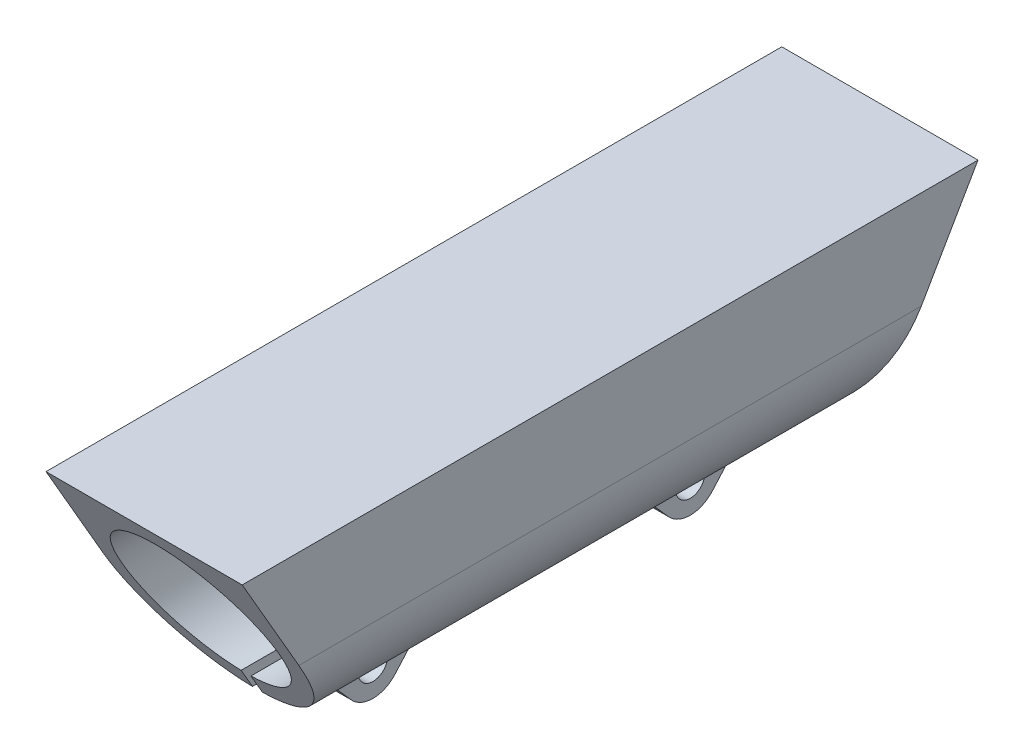
ISO-10303-21;
HEADER;
FILE_DESCRIPTION(('STEP AP214'),'2;1');
FILE_NAME('part.step','',(''),(''),'','','');
FILE_SCHEMA(('AUTOMOTIVE_DESIGN { 1 0 10303 214 1 1 1 1 }'));
ENDSEC;
DATA;
#1=APPLICATION_CONTEXT('core data for automotive mechanical design processes');
#2=APPLICATION_PROTOCOL_DEFINITION('international standard','automotive_design',2000,#1);
#3=PRODUCT_CONTEXT('',#1,'mechanical');
#4=PRODUCT('Part','Part','',(#3));
#5=PRODUCT_RELATED_PRODUCT_CATEGORY('part','',(#4));
#6=PRODUCT_DEFINITION_FORMATION('','',#4);
#7=PRODUCT_DEFINITION_CONTEXT('part definition',#1,'design');
#8=PRODUCT_DEFINITION('design','',#6,#7);
#9=PRODUCT_DEFINITION_SHAPE('','',#8);
#10=(LENGTH_UNIT() NAMED_UNIT(*) SI_UNIT(.MILLI.,.METRE.));
#11=(NAMED_UNIT(*) PLANE_ANGLE_UNIT() SI_UNIT($,.RADIAN.));
#12=(NAMED_UNIT(*) SI_UNIT($,.STERADIAN.) SOLID_ANGLE_UNIT());
#13=UNCERTAINTY_MEASURE_WITH_UNIT(LENGTH_MEASURE(1.E-05),#10,'distance_accuracy_value','');
#14=(GEOMETRIC_REPRESENTATION_CONTEXT(3) GLOBAL_UNCERTAINTY_ASSIGNED_CONTEXT((#13)) GLOBAL_UNIT_ASSIGNED_CONTEXT((#10,
#11,#12)) REPRESENTATION_CONTEXT('',''));
#15=CARTESIAN_POINT('',(0.,0.,0.));
#16=DIRECTION('',(0.,0.,1.));
#17=DIRECTION('',(1.,0.,0.));
#18=AXIS2_PLACEMENT_3D('',#15,#16,#17);
#19=CARTESIAN_POINT('',(2.,-9.05785759721761,60.));
#20=DIRECTION('',(0.,0.662204285051868,-0.749323351337021));
#21=DIRECTION('',(0.,0.749323351337021,0.662204285051868));
#22=AXIS2_PLACEMENT_3D('',#19,#20,#21);
#23=PLANE('',#22);
#24=CARTESIAN_POINT('',(0.,0.,68.0047580307815));
#25=DIRECTION('',(0.,0.662204285051868,-0.749323351337021));
#26=DIRECTION('',(0.,-0.749323351337021,-0.662204285051868));
#27=AXIS2_PLACEMENT_3D('',#24,#25,#26);
#28=ELLIPSE('',#27,13.3453735055193,10.);
#29=CARTESIAN_POINT('',(2.,-9.79795897113272,59.3459455116341));
#30=VERTEX_POINT('',#29);
#31=CARTESIAN_POINT('',(0.5,-9.9874921777191,59.1784481270442));
#32=VERTEX_POINT('',#31);
#33=EDGE_CURVE('E379',#30,#32,#28,.T.);
#34=ORIENTED_EDGE('',*,*,#33,.T.);
#35=DIRECTION('',(0.,-0.749323351337021,-0.662204285051868));
#36=VECTOR('',#35,1.);
#37=CARTESIAN_POINT('',(0.5,-9.05785759721761,60.));
#38=LINE('',#37,#36);
#39=CARTESIAN_POINT('',(0.5,-13.6764653678284,55.9183684170324));
#40=VERTEX_POINT('',#39);
#41=EDGE_CURVE('E298',#32,#40,#38,.T.);
#42=ORIENTED_EDGE('',*,*,#41,.T.);
#43=DIRECTION('',(-1.,0.,0.));
#44=VECTOR('',#43,1.);
#45=CARTESIAN_POINT('',(2.,-13.6764653678284,55.9183684170324));
#46=LINE('',#45,#44);
#47=CARTESIAN_POINT('',(2.,-13.6764653678284,55.9183684170324));
#48=VERTEX_POINT('',#47);
#49=EDGE_CURVE('E367',#48,#40,#46,.T.);
#50=ORIENTED_EDGE('',*,*,#49,.F.);
#51=DIRECTION('',(0.,-0.749323351337021,-0.662204285051868));
#52=VECTOR('',#51,1.);
#53=CARTESIAN_POINT('',(2.,-9.05785759721761,60.));
#54=LINE('',#53,#52);
#55=EDGE_CURVE('E347',#30,#48,#54,.T.);
#56=ORIENTED_EDGE('',*,*,#55,.F.);
#57=EDGE_LOOP('',(#34,#42,#50,#56));
#58=FACE_BOUND('',#57,.T.);
#59=ADVANCED_FACE('F41',(#58),#23,.F.);
#60=CARTESIAN_POINT('',(2.,-13.6764653678284,51.4224283090103));
#61=DIRECTION('',(0.,0.662204285051867,0.749323351337022));
#62=DIRECTION('',(0.,-0.749323351337022,0.662204285051867));
#63=AXIS2_PLACEMENT_3D('',#60,#61,#62);
#64=PLANE('',#63);
#65=DIRECTION('',(-1.,0.,0.));
#66=VECTOR('',#65,1.);
#67=CARTESIAN_POINT('',(2.,-13.6764653678284,51.4224283090103));
#68=LINE('',#67,#66);
#69=CARTESIAN_POINT('',(2.,-13.6764653678284,51.4224283090103));
#70=VERTEX_POINT('',#69);
#71=CARTESIAN_POINT('',(0.5,-13.6764653678284,51.4224283090103));
#72=VERTEX_POINT('',#71);
#73=EDGE_CURVE('E363',#70,#72,#68,.T.);
#74=ORIENTED_EDGE('',*,*,#73,.T.);
#75=DIRECTION('',(0.,0.749323351337022,-0.662204285051867));
#76=VECTOR('',#75,1.);
#77=CARTESIAN_POINT('',(0.5,-13.6764653678284,51.4224283090103));
#78=LINE('',#77,#76);
#79=CARTESIAN_POINT('',(0.5,-9.98749217771909,48.1623485989985));
#80=VERTEX_POINT('',#79);
#81=EDGE_CURVE('E296',#72,#80,#78,.T.);
#82=ORIENTED_EDGE('',*,*,#81,.T.);
#83=CARTESIAN_POINT('',(0.,0.,39.3360386952612));
#84=DIRECTION('',(0.,0.662204285051867,0.749323351337022));
#85=DIRECTION('',(0.,0.749323351337022,-0.662204285051867));
#86=AXIS2_PLACEMENT_3D('',#83,#84,#85);
#87=ELLIPSE('',#86,13.3453735055193,10.);
#88=CARTESIAN_POINT('',(2.,-9.79795897113272,47.9948512144085));
#89=VERTEX_POINT('',#88);
#90=EDGE_CURVE('E373',#80,#89,#87,.T.);
#91=ORIENTED_EDGE('',*,*,#90,.T.);
#92=DIRECTION('',(0.,0.749323351337022,-0.662204285051867));
#93=VECTOR('',#92,1.);
#94=CARTESIAN_POINT('',(2.,-13.6764653678284,51.4224283090103));
#95=LINE('',#94,#93);
#96=EDGE_CURVE('E352',#70,#89,#95,.T.);
#97=ORIENTED_EDGE('',*,*,#96,.F.);
#98=EDGE_LOOP('',(#74,#82,#91,#97));
#99=FACE_BOUND('',#98,.T.);
#100=ADVANCED_FACE('F434',(#99),#64,.F.);
#101=CARTESIAN_POINT('',(2.,-11.6898525126728,53.6703983630213));
#102=DIRECTION('',(-1.,0.,0.));
#103=DIRECTION('',(0.,0.,1.));
#104=AXIS2_PLACEMENT_3D('',#101,#102,#103);
#105=CYLINDRICAL_SURFACE('',#104,3.);
#106=CARTESIAN_POINT('',(0.5,-11.6898525126728,53.6703983630213));
#107=DIRECTION('',(1.,0.,0.));
#108=DIRECTION('',(0.,0.,-1.));
#109=AXIS2_PLACEMENT_3D('',#106,#107,#108);
#110=CIRCLE('',#109,3.);
#111=EDGE_CURVE('E294',#40,#72,#110,.T.);
#112=ORIENTED_EDGE('',*,*,#111,.T.);
#113=ORIENTED_EDGE('',*,*,#73,.F.);
#114=CARTESIAN_POINT('',(2.,-11.6898525126728,53.6703983630213));
#115=DIRECTION('',(1.,0.,0.));
#116=DIRECTION('',(0.,0.,-1.));
#117=AXIS2_PLACEMENT_3D('',#114,#115,#116);
#118=CIRCLE('',#117,3.);
#119=EDGE_CURVE('E349',#48,#70,#118,.T.);
#120=ORIENTED_EDGE('',*,*,#119,.F.);
#121=ORIENTED_EDGE('',*,*,#49,.T.);
#122=EDGE_LOOP('',(#112,#113,#120,#121));
#123=FACE_BOUND('',#122,.T.);
#124=ADVANCED_FACE('F447',(#123),#105,.T.);
#125=CARTESIAN_POINT('',(2.,-11.6898525126728,53.6703983630213));
#126=DIRECTION('',(-1.,0.,0.));
#127=DIRECTION('',(0.,0.,1.));
#128=AXIS2_PLACEMENT_3D('',#125,#126,#127);
#129=CYLINDRICAL_SURFACE('',#128,1.49999999999999);
#130=CARTESIAN_POINT('',(0.5,-11.6898525126728,53.6703983630213));
#131=DIRECTION('',(1.,0.,0.));
#132=DIRECTION('',(0.,0.,-1.));
#133=AXIS2_PLACEMENT_3D('',#130,#131,#132);
#134=CIRCLE('',#133,1.49999999999999);
#135=CARTESIAN_POINT('',(0.5,-11.6898525126728,52.1703983630213));
#136=VERTEX_POINT('',#135);
#137=EDGE_CURVE('E291',#136,#136,#134,.T.);
#138=ORIENTED_EDGE('',*,*,#137,.F.);
#139=EDGE_LOOP('',(#138));
#140=FACE_BOUND('',#139,.T.);
#141=CARTESIAN_POINT('',(2.,-11.6898525126728,53.6703983630213));
#142=DIRECTION('',(1.,0.,0.));
#143=DIRECTION('',(0.,0.,-1.));
#144=AXIS2_PLACEMENT_3D('',#141,#142,#143);
#145=CIRCLE('',#144,1.49999999999999);
#146=CARTESIAN_POINT('',(2.,-11.6898525126728,52.1703983630213));
#147=VERTEX_POINT('',#146);
#148=EDGE_CURVE('E341',#147,#147,#145,.T.);
#149=ORIENTED_EDGE('',*,*,#148,.T.);
#150=EDGE_LOOP('',(#149));
#151=FACE_BOUND('',#150,.T.);
#152=ADVANCED_FACE('F487',(#140,#151),#129,.F.);
#153=CARTESIAN_POINT('',(2.,-13.6764653678284,23.5775716909897));
#154=DIRECTION('',(0.,0.662204285051867,-0.749323351337022));
#155=DIRECTION('',(0.,0.749323351337022,0.662204285051867));
#156=AXIS2_PLACEMENT_3D('',#153,#154,#155);
#157=PLANE('',#156);
#158=CARTESIAN_POINT('',(0.,0.,35.6639613047388));
#159=DIRECTION('',(0.,0.662204285051867,-0.749323351337022));
#160=DIRECTION('',(0.,-0.749323351337022,-0.662204285051867));
#161=AXIS2_PLACEMENT_3D('',#158,#159,#160);
#162=ELLIPSE('',#161,13.3453735055193,10.);
#163=CARTESIAN_POINT('',(2.,-9.79795897113272,27.0051487855915));
#164=VERTEX_POINT('',#163);
#165=CARTESIAN_POINT('',(0.5,-9.98749217771909,26.8376514010015));
#166=VERTEX_POINT('',#165);
#167=EDGE_CURVE('E58',#164,#166,#162,.T.);
#168=ORIENTED_EDGE('',*,*,#167,.T.);
#169=DIRECTION('',(0.,-0.749323351337022,-0.662204285051867));
#170=VECTOR('',#169,1.);
#171=CARTESIAN_POINT('',(0.5,-13.6764653678284,23.5775716909897));
#172=LINE('',#171,#170);
#173=CARTESIAN_POINT('',(0.5,-13.6764653678284,23.5775716909897));
#174=VERTEX_POINT('',#173);
#175=EDGE_CURVE('E288',#166,#174,#172,.T.);
#176=ORIENTED_EDGE('',*,*,#175,.T.);
#177=DIRECTION('',(-1.,0.,0.));
#178=VECTOR('',#177,1.);
#179=CARTESIAN_POINT('',(2.,-13.6764653678284,23.5775716909897));
#180=LINE('',#179,#178);
#181=CARTESIAN_POINT('',(2.,-13.6764653678284,23.5775716909897));
#182=VERTEX_POINT('',#181);
#183=EDGE_CURVE('E302',#182,#174,#180,.T.);
#184=ORIENTED_EDGE('',*,*,#183,.F.);
#185=DIRECTION('',(0.,-0.749323351337022,-0.662204285051867));
#186=VECTOR('',#185,1.);
#187=CARTESIAN_POINT('',(2.,-13.6764653678284,23.5775716909897));
#188=LINE('',#187,#186);
#189=EDGE_CURVE('E314',#164,#182,#188,.T.);
#190=ORIENTED_EDGE('',*,*,#189,.F.);
#191=EDGE_LOOP('',(#168,#176,#184,#190));
#192=FACE_BOUND('',#191,.T.);
#193=ADVANCED_FACE('F491',(#192),#157,.F.);
#194=CARTESIAN_POINT('',(2.,-9.05785759721761,15.));
#195=DIRECTION('',(0.,0.662204285051868,0.749323351337021));
#196=DIRECTION('',(0.,-0.749323351337021,0.662204285051868));
#197=AXIS2_PLACEMENT_3D('',#194,#195,#196);
#198=PLANE('',#197);
#199=DIRECTION('',(-1.,0.,0.));
#200=VECTOR('',#199,1.);
#201=CARTESIAN_POINT('',(2.,-13.6764653678284,19.0816315829676));
#202=LINE('',#201,#200);
#203=CARTESIAN_POINT('',(2.,-13.6764653678284,19.0816315829676));
#204=VERTEX_POINT('',#203);
#205=CARTESIAN_POINT('',(0.5,-13.6764653678284,19.0816315829676));
#206=VERTEX_POINT('',#205);
#207=EDGE_CURVE('E306',#204,#206,#202,.T.);
#208=ORIENTED_EDGE('',*,*,#207,.T.);
#209=DIRECTION('',(0.,0.749323351337021,-0.662204285051868));
#210=VECTOR('',#209,1.);
#211=CARTESIAN_POINT('',(0.5,-9.05785759721761,15.));
#212=LINE('',#211,#210);
#213=CARTESIAN_POINT('',(0.5,-9.98749217771909,15.8215518729558));
#214=VERTEX_POINT('',#213);
#215=EDGE_CURVE('E286',#206,#214,#212,.T.);
#216=ORIENTED_EDGE('',*,*,#215,.T.);
#217=CARTESIAN_POINT('',(0.,0.,6.99524196921851));
#218=DIRECTION('',(0.,0.662204285051868,0.749323351337021));
#219=DIRECTION('',(0.,0.749323351337021,-0.662204285051868));
#220=AXIS2_PLACEMENT_3D('',#217,#218,#219);
#221=ELLIPSE('',#220,13.3453735055193,10.);
#222=CARTESIAN_POINT('',(2.,-9.79795897113272,15.6540544883659));
#223=VERTEX_POINT('',#222);
#224=EDGE_CURVE('E334',#214,#223,#221,.T.);
#225=ORIENTED_EDGE('',*,*,#224,.T.);
#226=DIRECTION('',(0.,0.749323351337021,-0.662204285051868));
#227=VECTOR('',#226,1.);
#228=CARTESIAN_POINT('',(2.,-9.05785759721761,15.));
#229=LINE('',#228,#227);
#230=EDGE_CURVE('E309',#204,#223,#229,.T.);
#231=ORIENTED_EDGE('',*,*,#230,.F.);
#232=EDGE_LOOP('',(#208,#216,#225,#231));
#233=FACE_BOUND('',#232,.T.);
#234=ADVANCED_FACE('F542',(#233),#198,.F.);
#235=CARTESIAN_POINT('',(2.,-11.6898525126728,21.3296016369787));
#236=DIRECTION('',(-1.,0.,0.));
#237=DIRECTION('',(0.,0.,1.));
#238=AXIS2_PLACEMENT_3D('',#235,#236,#237);
#239=CYLINDRICAL_SURFACE('',#238,3.);
#240=CARTESIAN_POINT('',(0.5,-11.6898525126728,21.3296016369787));
#241=DIRECTION('',(1.,0.,0.));
#242=DIRECTION('',(0.,0.,-1.));
#243=AXIS2_PLACEMENT_3D('',#240,#241,#242);
#244=CIRCLE('',#243,3.);
#245=EDGE_CURVE('E284',#174,#206,#244,.T.);
#246=ORIENTED_EDGE('',*,*,#245,.T.);
#247=ORIENTED_EDGE('',*,*,#207,.F.);
#248=CARTESIAN_POINT('',(2.,-11.6898525126728,21.3296016369787));
#249=DIRECTION('',(1.,0.,0.));
#250=DIRECTION('',(0.,0.,1.));
#251=AXIS2_PLACEMENT_3D('',#248,#249,#250);
#252=CIRCLE('',#251,3.);
#253=EDGE_CURVE('E323',#182,#204,#252,.T.);
#254=ORIENTED_EDGE('',*,*,#253,.F.);
#255=ORIENTED_EDGE('',*,*,#183,.T.);
#256=EDGE_LOOP('',(#246,#247,#254,#255));
#257=FACE_BOUND('',#256,.T.);
#258=ADVANCED_FACE('F537',(#257),#239,.T.);
#259=CARTESIAN_POINT('',(2.,-11.6898525126728,21.3296016369787));
#260=DIRECTION('',(-1.,0.,0.));
#261=DIRECTION('',(0.,0.,1.));
#262=AXIS2_PLACEMENT_3D('',#259,#260,#261);
#263=CYLINDRICAL_SURFACE('',#262,1.50000000000001);
#264=CARTESIAN_POINT('',(0.5,-11.6898525126728,21.3296016369787));
#265=DIRECTION('',(1.,0.,0.));
#266=DIRECTION('',(0.,0.,-1.));
#267=AXIS2_PLACEMENT_3D('',#264,#265,#266);
#268=CIRCLE('',#267,1.50000000000001);
#269=CARTESIAN_POINT('',(0.5,-11.6898525126728,19.8296016369787));
#270=VERTEX_POINT('',#269);
#271=EDGE_CURVE('E45',#270,#270,#268,.T.);
#272=ORIENTED_EDGE('',*,*,#271,.F.);
#273=EDGE_LOOP('',(#272));
#274=FACE_BOUND('',#273,.T.);
#275=CARTESIAN_POINT('',(2.,-11.6898525126728,21.3296016369787));
#276=DIRECTION('',(1.,0.,0.));
#277=DIRECTION('',(0.,0.,1.));
#278=AXIS2_PLACEMENT_3D('',#275,#276,#277);
#279=CIRCLE('',#278,1.50000000000001);
#280=CARTESIAN_POINT('',(2.,-11.6898525126728,22.8296016369787));
#281=VERTEX_POINT('',#280);
#282=EDGE_CURVE('E320',#281,#281,#279,.T.);
#283=ORIENTED_EDGE('',*,*,#282,.T.);
#284=EDGE_LOOP('',(#283));
#285=FACE_BOUND('',#284,.T.);
#286=ADVANCED_FACE('F533',(#274,#285),#263,.F.);
#287=CARTESIAN_POINT('',(0.5,-7.98435971133565,75.));
#288=DIRECTION('',(1.,0.,0.));
#289=DIRECTION('',(0.,1.,0.));
#290=AXIS2_PLACEMENT_3D('',#287,#288,#289);
#291=PLANE('',#290);
#292=DIRECTION('',(0.,0.,-1.));
#293=VECTOR('',#292,1.);
#294=CARTESIAN_POINT('',(0.500000000000005,-9.98749217771909,75.));
#295=LINE('',#294,#293);
#296=CARTESIAN_POINT('',(0.500000000000056,-9.98749217771909,63.4557434679124));
#297=VERTEX_POINT('',#296);
#298=EDGE_CURVE('E240',#297,#32,#295,.T.);
#299=ORIENTED_EDGE('',*,*,#298,.F.);
#300=DIRECTION('',(0.,0.865941487065101,0.50014531986162));
#301=VECTOR('',#300,1.);
#302=CARTESIAN_POINT('',(0.5,-3.48565591904593,67.2110352790293));
#303=LINE('',#302,#301);
#304=CARTESIAN_POINT('',(0.5,-7.98435971133565,64.6127007717137));
#305=VERTEX_POINT('',#304);
#306=EDGE_CURVE('E260',#297,#305,#303,.T.);
#307=ORIENTED_EDGE('',*,*,#306,.T.);
#308=DIRECTION('',(0.,0.,-1.));
#309=VECTOR('',#308,1.);
#310=CARTESIAN_POINT('',(0.5,-7.98435971133565,75.));
#311=LINE('',#310,#309);
#312=CARTESIAN_POINT('',(0.5,-7.98435971133565,10.3872992282863));
#313=VERTEX_POINT('',#312);
#314=EDGE_CURVE('E242',#305,#313,#311,.T.);
#315=ORIENTED_EDGE('',*,*,#314,.T.);
#316=DIRECTION('',(0.,-0.865941487065101,0.50014531986162));
#317=VECTOR('',#316,1.);
#318=CARTESIAN_POINT('',(0.500000000000002,-35.9678995712676,26.5498652944319));
#319=LINE('',#318,#317);
#320=CARTESIAN_POINT('',(0.499999999998769,-9.98749217771909,11.5442565320876));
#321=VERTEX_POINT('',#320);
#322=EDGE_CURVE('E471',#313,#321,#319,.T.);
#323=ORIENTED_EDGE('',*,*,#322,.T.);
#324=EDGE_CURVE('E239',#214,#321,#295,.T.);
#325=ORIENTED_EDGE('',*,*,#324,.F.);
#326=ORIENTED_EDGE('',*,*,#215,.F.);
#327=ORIENTED_EDGE('',*,*,#245,.F.);
#328=ORIENTED_EDGE('',*,*,#175,.F.);
#329=EDGE_CURVE('E243',#80,#166,#295,.T.);
#330=ORIENTED_EDGE('',*,*,#329,.F.);
#331=ORIENTED_EDGE('',*,*,#81,.F.);
#332=ORIENTED_EDGE('',*,*,#111,.F.);
#333=ORIENTED_EDGE('',*,*,#41,.F.);
#334=EDGE_LOOP('',(#299,#307,#315,#323,#325,#326,#327,#328,#330,#331,#332,#333));
#335=FACE_BOUND('',#334,.T.);
#336=ORIENTED_EDGE('',*,*,#271,.T.);
#337=EDGE_LOOP('',(#336));
#338=FACE_BOUND('',#337,.T.);
#339=ORIENTED_EDGE('',*,*,#137,.T.);
#340=EDGE_LOOP('',(#339));
#341=FACE_BOUND('',#340,.T.);
#342=ADVANCED_FACE('F462',(#335,#338,#341),#291,.F.);
#343=CARTESIAN_POINT('',(0.,0.,75.));
#344=DIRECTION('',(0.,0.,-1.));
#345=DIRECTION('',(-1.,0.,0.));
#346=AXIS2_PLACEMENT_3D('',#343,#344,#345);
#347=CYLINDRICAL_SURFACE('',#346,10.);
#348=DIRECTION('',(0.,0.,-1.));
#349=VECTOR('',#348,1.);
#350=CARTESIAN_POINT('',(10.,0.,75.));
#351=LINE('',#350,#349);
#352=CARTESIAN_POINT('',(10.,0.,69.2242596372563));
#353=VERTEX_POINT('',#352);
#354=CARTESIAN_POINT('',(10.,0.,5.7757403627437));
#355=VERTEX_POINT('',#354);
#356=EDGE_CURVE('E231',#353,#355,#351,.T.);
#357=ORIENTED_EDGE('',*,*,#356,.F.);
#358=CARTESIAN_POINT('',(0.,0.,69.2242596372563));
#359=DIRECTION('',(0.,0.50014531986162,-0.865941487065101));
#360=DIRECTION('',(0.,-0.865941487065101,-0.50014531986162));
#361=AXIS2_PLACEMENT_3D('',#358,#359,#360);
#362=ELLIPSE('',#361,11.5481243818131,10.);
#363=EDGE_CURVE('E254',#353,#297,#362,.T.);
#364=ORIENTED_EDGE('',*,*,#363,.T.);
#365=ORIENTED_EDGE('',*,*,#298,.T.);
#366=ORIENTED_EDGE('',*,*,#33,.F.);
#367=DIRECTION('',(0.,0.,-1.));
#368=VECTOR('',#367,1.);
#369=CARTESIAN_POINT('',(2.,-9.79795897113272,75.));
#370=LINE('',#369,#368);
#371=EDGE_CURVE('E249',#30,#89,#370,.T.);
#372=ORIENTED_EDGE('',*,*,#371,.T.);
#373=ORIENTED_EDGE('',*,*,#90,.F.);
#374=ORIENTED_EDGE('',*,*,#329,.T.);
#375=ORIENTED_EDGE('',*,*,#167,.F.);
#376=DIRECTION('',(0.,0.,-1.));
#377=VECTOR('',#376,1.);
#378=CARTESIAN_POINT('',(2.,-9.79795897113272,75.));
#379=LINE('',#378,#377);
#380=EDGE_CURVE('E11',#223,#164,#379,.F.);
#381=ORIENTED_EDGE('',*,*,#380,.F.);
#382=ORIENTED_EDGE('',*,*,#224,.F.);
#383=ORIENTED_EDGE('',*,*,#324,.T.);
#384=CARTESIAN_POINT('',(0.,0.,5.7757403627437));
#385=DIRECTION('',(0.,0.50014531986162,0.865941487065101));
#386=DIRECTION('',(0.,0.865941487065101,-0.50014531986162));
#387=AXIS2_PLACEMENT_3D('',#384,#385,#386);
#388=ELLIPSE('',#387,11.5481243818131,10.);
#389=EDGE_CURVE('E468',#321,#355,#388,.T.);
#390=ORIENTED_EDGE('',*,*,#389,.T.);
#391=EDGE_LOOP('',(#357,#364,#365,#366,#372,#373,#374,#375,#381,#382,#383,#390));
#392=FACE_BOUND('',#391,.T.);
#393=ADVANCED_FACE('F453',(#392),#347,.T.);
#394=CARTESIAN_POINT('',(0.,0.,75.));
#395=DIRECTION('',(0.,0.,-1.));
#396=DIRECTION('',(-1.,0.,0.));
#397=AXIS2_PLACEMENT_3D('',#394,#395,#396);
#398=CYLINDRICAL_SURFACE('',#397,10.);
#399=DIRECTION('',(0.,0.,-1.));
#400=VECTOR('',#399,1.);
#401=CARTESIAN_POINT('',(-0.5,-9.98749217771909,75.));
#402=LINE('',#401,#400);
#403=CARTESIAN_POINT('',(-0.500000000000004,-9.98749217771909,63.4557434679124));
#404=VERTEX_POINT('',#403);
#405=CARTESIAN_POINT('',(-0.5,-9.9874921777191,59.1784481270442));
#406=VERTEX_POINT('',#405);
#407=EDGE_CURVE('E233',#404,#406,#402,.T.);
#408=ORIENTED_EDGE('',*,*,#407,.F.);
#409=CARTESIAN_POINT('',(0.,0.,69.2242596372563));
#410=DIRECTION('',(0.,0.50014531986162,-0.865941487065101));
#411=DIRECTION('',(0.,-0.865941487065101,-0.50014531986162));
#412=AXIS2_PLACEMENT_3D('',#409,#410,#411);
#413=ELLIPSE('',#412,11.5481243818131,10.);
#414=CARTESIAN_POINT('',(-10.,0.,69.2242596372563));
#415=VERTEX_POINT('',#414);
#416=EDGE_CURVE('E265',#404,#415,#413,.T.);
#417=ORIENTED_EDGE('',*,*,#416,.T.);
#418=DIRECTION('',(0.,0.,-1.));
#419=VECTOR('',#418,1.);
#420=CARTESIAN_POINT('',(-10.,0.,75.));
#421=LINE('',#420,#419);
#422=CARTESIAN_POINT('',(-10.,0.,5.7757403627437));
#423=VERTEX_POINT('',#422);
#424=EDGE_CURVE('E224',#415,#423,#421,.T.);
#425=ORIENTED_EDGE('',*,*,#424,.T.);
#426=CARTESIAN_POINT('',(0.,0.,5.7757403627437));
#427=DIRECTION('',(0.,0.50014531986162,0.865941487065101));
#428=DIRECTION('',(0.,0.865941487065101,-0.50014531986162));
#429=AXIS2_PLACEMENT_3D('',#426,#427,#428);
#430=ELLIPSE('',#429,11.5481243818131,10.);
#431=CARTESIAN_POINT('',(-0.500000000000004,-9.98749217771909,11.5442565320876));
#432=VERTEX_POINT('',#431);
#433=EDGE_CURVE('E399',#423,#432,#430,.T.);
#434=ORIENTED_EDGE('',*,*,#433,.T.);
#435=CARTESIAN_POINT('',(-0.5,-9.98749217771909,15.8215518729558));
#436=VERTEX_POINT('',#435);
#437=EDGE_CURVE('E384',#436,#432,#402,.T.);
#438=ORIENTED_EDGE('',*,*,#437,.F.);
#439=CARTESIAN_POINT('',(0.,0.,6.99524196921851));
#440=DIRECTION('',(0.,0.662204285051868,0.749323351337021));
#441=DIRECTION('',(0.,0.749323351337021,-0.662204285051868));
#442=AXIS2_PLACEMENT_3D('',#439,#440,#441);
#443=ELLIPSE('',#442,13.3453735055193,10.);
#444=CARTESIAN_POINT('',(-2.,-9.79795897113272,15.6540544883659));
#445=VERTEX_POINT('',#444);
#446=EDGE_CURVE('E329',#445,#436,#443,.T.);
#447=ORIENTED_EDGE('',*,*,#446,.F.);
#448=DIRECTION('',(0.,0.,-1.));
#449=VECTOR('',#448,1.);
#450=CARTESIAN_POINT('',(-2.,-9.79795897113272,75.));
#451=LINE('',#450,#449);
#452=CARTESIAN_POINT('',(-2.,-9.79795897113272,27.0051487855915));
#453=VERTEX_POINT('',#452);
#454=EDGE_CURVE('E50',#445,#453,#451,.F.);
#455=ORIENTED_EDGE('',*,*,#454,.T.);
#456=CARTESIAN_POINT('',(0.,0.,35.6639613047388));
#457=DIRECTION('',(0.,0.662204285051867,-0.749323351337022));
#458=DIRECTION('',(0.,-0.749323351337022,-0.662204285051867));
#459=AXIS2_PLACEMENT_3D('',#456,#457,#458);
#460=ELLIPSE('',#459,13.3453735055193,10.);
#461=CARTESIAN_POINT('',(-0.5,-9.98749217771909,26.8376514010015));
#462=VERTEX_POINT('',#461);
#463=EDGE_CURVE('E337',#462,#453,#460,.T.);
#464=ORIENTED_EDGE('',*,*,#463,.F.);
#465=CARTESIAN_POINT('',(-0.5,-9.98749217771909,48.1623485989985));
#466=VERTEX_POINT('',#465);
#467=EDGE_CURVE('E385',#466,#462,#402,.T.);
#468=ORIENTED_EDGE('',*,*,#467,.F.);
#469=CARTESIAN_POINT('',(0.,0.,39.3360386952612));
#470=DIRECTION('',(0.,0.662204285051867,0.749323351337022));
#471=DIRECTION('',(0.,0.749323351337022,-0.662204285051867));
#472=AXIS2_PLACEMENT_3D('',#469,#470,#471);
#473=ELLIPSE('',#472,13.3453735055193,10.);
#474=CARTESIAN_POINT('',(-2.,-9.79795897113272,47.9948512144085));
#475=VERTEX_POINT('',#474);
#476=EDGE_CURVE('E370',#475,#466,#473,.T.);
#477=ORIENTED_EDGE('',*,*,#476,.F.);
#478=DIRECTION('',(0.,0.,-1.));
#479=VECTOR('',#478,1.);
#480=CARTESIAN_POINT('',(-2.,-9.79795897113272,75.));
#481=LINE('',#480,#479);
#482=CARTESIAN_POINT('',(-2.,-9.79795897113272,59.3459455116341));
#483=VERTEX_POINT('',#482);
#484=EDGE_CURVE('E246',#483,#475,#481,.T.);
#485=ORIENTED_EDGE('',*,*,#484,.F.);
#486=CARTESIAN_POINT('',(0.,0.,68.0047580307815));
#487=DIRECTION('',(0.,0.662204285051868,-0.749323351337021));
#488=DIRECTION('',(0.,-0.749323351337021,-0.662204285051868));
#489=AXIS2_PLACEMENT_3D('',#486,#487,#488);
#490=ELLIPSE('',#489,13.3453735055193,10.);
#491=EDGE_CURVE('E376',#406,#483,#490,.T.);
#492=ORIENTED_EDGE('',*,*,#491,.F.);
#493=EDGE_LOOP('',(#408,#417,#425,#434,#438,#447,#455,#464,#468,#477,#485,#492));
#494=FACE_BOUND('',#493,.T.);
#495=ADVANCED_FACE('F398',(#494),#398,.T.);
#496=CARTESIAN_POINT('',(-0.5,-7.98435971133565,75.));
#497=DIRECTION('',(-1.,0.,0.));
#498=DIRECTION('',(0.,-1.,0.));
#499=AXIS2_PLACEMENT_3D('',#496,#497,#498);
#500=PLANE('',#499);
#501=DIRECTION('',(0.,0.,-1.));
#502=VECTOR('',#501,1.);
#503=CARTESIAN_POINT('',(-0.5,-7.98435971133565,75.));
#504=LINE('',#503,#502);
#505=CARTESIAN_POINT('',(-0.5,-7.98435971133565,64.6127007717137));
#506=VERTEX_POINT('',#505);
#507=CARTESIAN_POINT('',(-0.5,-7.98435971133565,10.3872992282863));
#508=VERTEX_POINT('',#507);
#509=EDGE_CURVE('E214',#506,#508,#504,.T.);
#510=ORIENTED_EDGE('',*,*,#509,.F.);
#511=DIRECTION('',(0.,-0.865941487065101,-0.50014531986162));
#512=VECTOR('',#511,1.);
#513=CARTESIAN_POINT('',(-0.5,-3.48565591904593,67.2110352790293));
#514=LINE('',#513,#512);
#515=EDGE_CURVE('E483',#506,#404,#514,.T.);
#516=ORIENTED_EDGE('',*,*,#515,.T.);
#517=ORIENTED_EDGE('',*,*,#407,.T.);
#518=DIRECTION('',(0.,0.749323351337021,0.662204285051868));
#519=VECTOR('',#518,1.);
#520=CARTESIAN_POINT('',(-0.5,-9.05785759721761,60.));
#521=LINE('',#520,#519);
#522=CARTESIAN_POINT('',(-0.5,-13.6764653678284,55.9183684170324));
#523=VERTEX_POINT('',#522);
#524=EDGE_CURVE('E278',#523,#406,#521,.T.);
#525=ORIENTED_EDGE('',*,*,#524,.F.);
#526=CARTESIAN_POINT('',(-0.5,-11.6898525126728,53.6703983630213));
#527=DIRECTION('',(-1.,0.,0.));
#528=DIRECTION('',(0.,0.,1.));
#529=AXIS2_PLACEMENT_3D('',#526,#527,#528);
#530=CIRCLE('',#529,3.);
#531=CARTESIAN_POINT('',(-0.5,-13.6764653678284,51.4224283090103));
#532=VERTEX_POINT('',#531);
#533=EDGE_CURVE('E276',#532,#523,#530,.T.);
#534=ORIENTED_EDGE('',*,*,#533,.F.);
#535=DIRECTION('',(0.,-0.749323351337022,0.662204285051867));
#536=VECTOR('',#535,1.);
#537=CARTESIAN_POINT('',(-0.5,-13.6764653678284,51.4224283090103));
#538=LINE('',#537,#536);
#539=EDGE_CURVE('E273',#466,#532,#538,.T.);
#540=ORIENTED_EDGE('',*,*,#539,.F.);
#541=ORIENTED_EDGE('',*,*,#467,.T.);
#542=DIRECTION('',(0.,0.749323351337022,0.662204285051867));
#543=VECTOR('',#542,1.);
#544=CARTESIAN_POINT('',(-0.5,-13.6764653678284,23.5775716909897));
#545=LINE('',#544,#543);
#546=CARTESIAN_POINT('',(-0.5,-13.6764653678284,23.5775716909897));
#547=VERTEX_POINT('',#546);
#548=EDGE_CURVE('E271',#547,#462,#545,.T.);
#549=ORIENTED_EDGE('',*,*,#548,.F.);
#550=CARTESIAN_POINT('',(-0.5,-11.6898525126728,21.3296016369787));
#551=DIRECTION('',(-1.,0.,0.));
#552=DIRECTION('',(0.,0.,1.));
#553=AXIS2_PLACEMENT_3D('',#550,#551,#552);
#554=CIRCLE('',#553,3.);
#555=CARTESIAN_POINT('',(-0.5,-13.6764653678284,19.0816315829676));
#556=VERTEX_POINT('',#555);
#557=EDGE_CURVE('E253',#556,#547,#554,.T.);
#558=ORIENTED_EDGE('',*,*,#557,.F.);
#559=DIRECTION('',(0.,-0.749323351337021,0.662204285051868));
#560=VECTOR('',#559,1.);
#561=CARTESIAN_POINT('',(-0.5,-9.05785759721761,15.));
#562=LINE('',#561,#560);
#563=EDGE_CURVE('E257',#436,#556,#562,.T.);
#564=ORIENTED_EDGE('',*,*,#563,.F.);
#565=ORIENTED_EDGE('',*,*,#437,.T.);
#566=DIRECTION('',(0.,0.865941487065101,-0.50014531986162));
#567=VECTOR('',#566,1.);
#568=CARTESIAN_POINT('',(-0.500000000000002,-35.9678995712676,26.5498652944319));
#569=LINE('',#568,#567);
#570=EDGE_CURVE('E396',#432,#508,#569,.T.);
#571=ORIENTED_EDGE('',*,*,#570,.T.);
#572=EDGE_LOOP('',(#510,#516,#517,#525,#534,#540,#541,#549,#558,#564,#565,#571));
#573=FACE_BOUND('',#572,.T.);
#574=CARTESIAN_POINT('',(-0.5,-11.6898525126728,21.3296016369787));
#575=DIRECTION('',(-1.,0.,0.));
#576=DIRECTION('',(0.,0.,1.));
#577=AXIS2_PLACEMENT_3D('',#574,#575,#576);
#578=CIRCLE('',#577,1.50000000000001);
#579=CARTESIAN_POINT('',(-0.5,-11.6898525126728,22.8296016369787));
#580=VERTEX_POINT('',#579);
#581=EDGE_CURVE('E251',#580,#580,#578,.T.);
#582=ORIENTED_EDGE('',*,*,#581,.T.);
#583=EDGE_LOOP('',(#582));
#584=FACE_BOUND('',#583,.T.);
#585=CARTESIAN_POINT('',(-0.5,-11.6898525126728,53.6703983630213));
#586=DIRECTION('',(-1.,0.,0.));
#587=DIRECTION('',(0.,0.,1.));
#588=AXIS2_PLACEMENT_3D('',#585,#586,#587);
#589=CIRCLE('',#588,1.49999999999999);
#590=CARTESIAN_POINT('',(-0.5,-11.6898525126728,55.1703983630213));
#591=VERTEX_POINT('',#590);
#592=EDGE_CURVE('E281',#591,#591,#589,.T.);
#593=ORIENTED_EDGE('',*,*,#592,.T.);
#594=EDGE_LOOP('',(#593));
#595=FACE_BOUND('',#594,.T.);
#596=ADVANCED_FACE('F395',(#573,#584,#595),#500,.F.);
#597=CARTESIAN_POINT('',(0.,0.,75.));
#598=DIRECTION('',(0.,0.,-1.));
#599=DIRECTION('',(-1.,0.,0.));
#600=AXIS2_PLACEMENT_3D('',#597,#598,#599);
#601=CYLINDRICAL_SURFACE('',#600,8.);
#602=ORIENTED_EDGE('',*,*,#314,.F.);
#603=CARTESIAN_POINT('',(0.,0.,69.2242596372563));
#604=DIRECTION('',(0.,0.50014531986162,-0.865941487065101));
#605=DIRECTION('',(0.,-0.865941487065101,-0.50014531986162));
#606=AXIS2_PLACEMENT_3D('',#603,#604,#605);
#607=ELLIPSE('',#606,9.2384995054505,8.);
#608=EDGE_CURVE('E476',#305,#506,#607,.F.);
#609=ORIENTED_EDGE('',*,*,#608,.T.);
#610=ORIENTED_EDGE('',*,*,#509,.T.);
#611=CARTESIAN_POINT('',(0.,0.,5.7757403627437));
#612=DIRECTION('',(0.,0.50014531986162,0.865941487065101));
#613=DIRECTION('',(0.,0.865941487065101,-0.50014531986162));
#614=AXIS2_PLACEMENT_3D('',#611,#612,#613);
#615=ELLIPSE('',#614,9.2384995054505,8.);
#616=EDGE_CURVE('E225',#508,#313,#615,.F.);
#617=ORIENTED_EDGE('',*,*,#616,.T.);
#618=EDGE_LOOP('',(#602,#609,#610,#617));
#619=FACE_BOUND('',#618,.T.);
#620=ADVANCED_FACE('F43',(#619),#601,.F.);
#621=CARTESIAN_POINT('',(10.,10.,75.));
#622=DIRECTION('',(-1.,0.,0.));
#623=DIRECTION('',(0.,-1.,0.));
#624=AXIS2_PLACEMENT_3D('',#621,#622,#623);
#625=PLANE('',#624);
#626=DIRECTION('',(0.,0.,-1.));
#627=VECTOR('',#626,1.);
#628=CARTESIAN_POINT('',(10.,10.,75.));
#629=LINE('',#628,#627);
#630=CARTESIAN_POINT('',(10.,10.,75.));
#631=VERTEX_POINT('',#630);
#632=CARTESIAN_POINT('',(10.,10.,0.));
#633=VERTEX_POINT('',#632);
#634=EDGE_CURVE('E229',#631,#633,#629,.T.);
#635=ORIENTED_EDGE('',*,*,#634,.F.);
#636=DIRECTION('',(0.,0.8659414870651,0.50014531986162));
#637=VECTOR('',#636,1.);
#638=CARTESIAN_POINT('',(10.,10.,75.));
#639=LINE('',#638,#637);
#640=EDGE_CURVE('E209',#353,#631,#639,.T.);
#641=ORIENTED_EDGE('',*,*,#640,.F.);
#642=ORIENTED_EDGE('',*,*,#356,.T.);
#643=DIRECTION('',(0.,-0.8659414870651,0.50014531986162));
#644=VECTOR('',#643,1.);
#645=CARTESIAN_POINT('',(10.,10.,0.));
#646=LINE('',#645,#644);
#647=EDGE_CURVE('E748',#633,#355,#646,.T.);
#648=ORIENTED_EDGE('',*,*,#647,.F.);
#649=EDGE_LOOP('',(#635,#641,#642,#648));
#650=FACE_BOUND('',#649,.T.);
#651=ADVANCED_FACE('F524',(#650),#625,.F.);
#652=CARTESIAN_POINT('',(-10.,10.,75.));
#653=DIRECTION('',(0.,-1.,0.));
#654=DIRECTION('',(0.,0.,-1.));
#655=AXIS2_PLACEMENT_3D('',#652,#653,#654);
#656=PLANE('',#655);
#657=DIRECTION('',(-1.,0.,0.));
#658=VECTOR('',#657,1.);
#659=CARTESIAN_POINT('',(-10.,10.,0.));
#660=LINE('',#659,#658);
#661=CARTESIAN_POINT('',(-10.,10.,0.));
#662=VERTEX_POINT('',#661);
#663=EDGE_CURVE('E215',#633,#662,#660,.T.);
#664=ORIENTED_EDGE('',*,*,#663,.T.);
#665=DIRECTION('',(0.,0.,-1.));
#666=VECTOR('',#665,1.);
#667=CARTESIAN_POINT('',(-10.,10.,75.));
#668=LINE('',#667,#666);
#669=CARTESIAN_POINT('',(-10.,10.,75.));
#670=VERTEX_POINT('',#669);
#671=EDGE_CURVE('E222',#670,#662,#668,.T.);
#672=ORIENTED_EDGE('',*,*,#671,.F.);
#673=DIRECTION('',(-1.,0.,0.));
#674=VECTOR('',#673,1.);
#675=CARTESIAN_POINT('',(-10.,10.,75.));
#676=LINE('',#675,#674);
#677=EDGE_CURVE('E203',#631,#670,#676,.T.);
#678=ORIENTED_EDGE('',*,*,#677,.F.);
#679=ORIENTED_EDGE('',*,*,#634,.T.);
#680=EDGE_LOOP('',(#664,#672,#678,#679));
#681=FACE_BOUND('',#680,.T.);
#682=ADVANCED_FACE('F228',(#681),#656,.F.);
#683=CARTESIAN_POINT('',(-10.,10.,75.));
#684=DIRECTION('',(1.,0.,0.));
#685=DIRECTION('',(0.,1.,0.));
#686=AXIS2_PLACEMENT_3D('',#683,#684,#685);
#687=PLANE('',#686);
#688=ORIENTED_EDGE('',*,*,#424,.F.);
#689=DIRECTION('',(0.,0.8659414870651,0.50014531986162));
#690=VECTOR('',#689,1.);
#691=CARTESIAN_POINT('',(-10.,10.,75.));
#692=LINE('',#691,#690);
#693=EDGE_CURVE('E206',#415,#670,#692,.T.);
#694=ORIENTED_EDGE('',*,*,#693,.T.);
#695=ORIENTED_EDGE('',*,*,#671,.T.);
#696=DIRECTION('',(0.,-0.8659414870651,0.50014531986162));
#697=VECTOR('',#696,1.);
#698=CARTESIAN_POINT('',(-10.,10.,0.));
#699=LINE('',#698,#697);
#700=EDGE_CURVE('E749',#662,#423,#699,.T.);
#701=ORIENTED_EDGE('',*,*,#700,.T.);
#702=EDGE_LOOP('',(#688,#694,#695,#701));
#703=FACE_BOUND('',#702,.T.);
#704=ADVANCED_FACE('F220',(#703),#687,.F.);
#705=CARTESIAN_POINT('',(2.,-11.6898525126728,53.6703983630213));
#706=DIRECTION('',(1.,0.,0.));
#707=DIRECTION('',(0.,0.,-1.));
#708=AXIS2_PLACEMENT_3D('',#705,#706,#707);
#709=PLANE('',#708);
#710=ORIENTED_EDGE('',*,*,#148,.F.);
#711=EDGE_LOOP('',(#710));
#712=FACE_BOUND('',#711,.T.);
#713=ORIENTED_EDGE('',*,*,#371,.F.);
#714=ORIENTED_EDGE('',*,*,#55,.T.);
#715=ORIENTED_EDGE('',*,*,#119,.T.);
#716=ORIENTED_EDGE('',*,*,#96,.T.);
#717=EDGE_LOOP('',(#713,#714,#715,#716));
#718=FACE_BOUND('',#717,.T.);
#719=ADVANCED_FACE('F436',(#712,#718),#709,.T.);
#720=CARTESIAN_POINT('',(-2.,-11.6898525126728,53.6703983630213));
#721=DIRECTION('',(1.,0.,0.));
#722=DIRECTION('',(0.,0.,-1.));
#723=AXIS2_PLACEMENT_3D('',#720,#721,#722);
#724=PLANE('',#723);
#725=CARTESIAN_POINT('',(-2.,-11.6898525126728,53.6703983630213));
#726=DIRECTION('',(1.,0.,0.));
#727=DIRECTION('',(0.,0.,-1.));
#728=AXIS2_PLACEMENT_3D('',#725,#726,#727);
#729=CIRCLE('',#728,1.49999999999999);
#730=CARTESIAN_POINT('',(-2.,-11.6898525126728,52.1703983630213));
#731=VERTEX_POINT('',#730);
#732=EDGE_CURVE('E340',#731,#731,#729,.T.);
#733=ORIENTED_EDGE('',*,*,#732,.T.);
#734=EDGE_LOOP('',(#733));
#735=FACE_BOUND('',#734,.T.);
#736=DIRECTION('',(0.,-0.749323351337021,-0.662204285051868));
#737=VECTOR('',#736,1.);
#738=CARTESIAN_POINT('',(-2.,-9.05785759721761,60.));
#739=LINE('',#738,#737);
#740=CARTESIAN_POINT('',(-2.,-13.6764653678284,55.9183684170324));
#741=VERTEX_POINT('',#740);
#742=EDGE_CURVE('E344',#483,#741,#739,.T.);
#743=ORIENTED_EDGE('',*,*,#742,.F.);
#744=ORIENTED_EDGE('',*,*,#484,.T.);
#745=DIRECTION('',(0.,0.749323351337022,-0.662204285051867));
#746=VECTOR('',#745,1.);
#747=CARTESIAN_POINT('',(-2.,-13.6764653678284,51.4224283090103));
#748=LINE('',#747,#746);
#749=CARTESIAN_POINT('',(-2.,-13.6764653678284,51.4224283090103));
#750=VERTEX_POINT('',#749);
#751=EDGE_CURVE('E350',#750,#475,#748,.T.);
#752=ORIENTED_EDGE('',*,*,#751,.F.);
#753=CARTESIAN_POINT('',(-2.,-11.6898525126728,53.6703983630213));
#754=DIRECTION('',(1.,0.,0.));
#755=DIRECTION('',(0.,0.,-1.));
#756=AXIS2_PLACEMENT_3D('',#753,#754,#755);
#757=CIRCLE('',#756,3.);
#758=EDGE_CURVE('E358',#741,#750,#757,.T.);
#759=ORIENTED_EDGE('',*,*,#758,.F.);
#760=EDGE_LOOP('',(#743,#744,#752,#759));
#761=FACE_BOUND('',#760,.T.);
#762=ADVANCED_FACE('F423',(#735,#761),#724,.F.);
#763=EDGE_CURVE('E366',#523,#741,#46,.T.);
#764=ORIENTED_EDGE('',*,*,#763,.F.);
#765=ORIENTED_EDGE('',*,*,#524,.T.);
#766=ORIENTED_EDGE('',*,*,#491,.T.);
#767=ORIENTED_EDGE('',*,*,#742,.T.);
#768=EDGE_LOOP('',(#764,#765,#766,#767));
#769=FACE_BOUND('',#768,.T.);
#770=ADVANCED_FACE('F426',(#769),#23,.F.);
#771=ORIENTED_EDGE('',*,*,#476,.T.);
#772=ORIENTED_EDGE('',*,*,#539,.T.);
#773=EDGE_CURVE('E355',#532,#750,#68,.T.);
#774=ORIENTED_EDGE('',*,*,#773,.T.);
#775=ORIENTED_EDGE('',*,*,#751,.T.);
#776=EDGE_LOOP('',(#771,#772,#774,#775));
#777=FACE_BOUND('',#776,.T.);
#778=ADVANCED_FACE('F415',(#777),#64,.F.);
#779=ORIENTED_EDGE('',*,*,#533,.T.);
#780=ORIENTED_EDGE('',*,*,#763,.T.);
#781=ORIENTED_EDGE('',*,*,#758,.T.);
#782=ORIENTED_EDGE('',*,*,#773,.F.);
#783=EDGE_LOOP('',(#779,#780,#781,#782));
#784=FACE_BOUND('',#783,.T.);
#785=ADVANCED_FACE('F417',(#784),#105,.T.);
#786=ORIENTED_EDGE('',*,*,#592,.F.);
#787=EDGE_LOOP('',(#786));
#788=FACE_BOUND('',#787,.T.);
#789=ORIENTED_EDGE('',*,*,#732,.F.);
#790=EDGE_LOOP('',(#789));
#791=FACE_BOUND('',#790,.T.);
#792=ADVANCED_FACE('F494',(#788,#791),#129,.F.);
#793=CARTESIAN_POINT('',(2.,-11.6898525126728,21.3296016369787));
#794=DIRECTION('',(-1.,0.,0.));
#795=DIRECTION('',(0.,0.,1.));
#796=AXIS2_PLACEMENT_3D('',#793,#794,#795);
#797=PLANE('',#796);
#798=ORIENTED_EDGE('',*,*,#282,.F.);
#799=EDGE_LOOP('',(#798));
#800=FACE_BOUND('',#799,.T.);
#801=ORIENTED_EDGE('',*,*,#230,.T.);
#802=ORIENTED_EDGE('',*,*,#380,.T.);
#803=ORIENTED_EDGE('',*,*,#189,.T.);
#804=ORIENTED_EDGE('',*,*,#253,.T.);
#805=EDGE_LOOP('',(#801,#802,#803,#804));
#806=FACE_BOUND('',#805,.T.);
#807=ADVANCED_FACE('F499',(#800,#806),#797,.F.);
#808=CARTESIAN_POINT('',(-2.,-11.6898525126728,21.3296016369787));
#809=DIRECTION('',(-1.,0.,0.));
#810=DIRECTION('',(0.,0.,1.));
#811=AXIS2_PLACEMENT_3D('',#808,#809,#810);
#812=PLANE('',#811);
#813=CARTESIAN_POINT('',(-2.,-11.6898525126728,21.3296016369787));
#814=DIRECTION('',(1.,0.,0.));
#815=DIRECTION('',(0.,0.,1.));
#816=AXIS2_PLACEMENT_3D('',#813,#814,#815);
#817=CIRCLE('',#816,1.50000000000001);
#818=CARTESIAN_POINT('',(-2.,-11.6898525126728,22.8296016369787));
#819=VERTEX_POINT('',#818);
#820=EDGE_CURVE('E326',#819,#819,#817,.T.);
#821=ORIENTED_EDGE('',*,*,#820,.T.);
#822=EDGE_LOOP('',(#821));
#823=FACE_BOUND('',#822,.T.);
#824=ORIENTED_EDGE('',*,*,#454,.F.);
#825=DIRECTION('',(0.,0.749323351337021,-0.662204285051868));
#826=VECTOR('',#825,1.);
#827=CARTESIAN_POINT('',(-2.,-9.05785759721761,15.));
#828=LINE('',#827,#826);
#829=CARTESIAN_POINT('',(-2.,-13.6764653678284,19.0816315829676));
#830=VERTEX_POINT('',#829);
#831=EDGE_CURVE('E310',#830,#445,#828,.T.);
#832=ORIENTED_EDGE('',*,*,#831,.F.);
#833=CARTESIAN_POINT('',(-2.,-11.6898525126728,21.3296016369787));
#834=DIRECTION('',(1.,0.,0.));
#835=DIRECTION('',(0.,0.,1.));
#836=AXIS2_PLACEMENT_3D('',#833,#834,#835);
#837=CIRCLE('',#836,3.);
#838=CARTESIAN_POINT('',(-2.,-13.6764653678284,23.5775716909897));
#839=VERTEX_POINT('',#838);
#840=EDGE_CURVE('E313',#839,#830,#837,.T.);
#841=ORIENTED_EDGE('',*,*,#840,.F.);
#842=DIRECTION('',(0.,-0.749323351337022,-0.662204285051867));
#843=VECTOR('',#842,1.);
#844=CARTESIAN_POINT('',(-2.,-13.6764653678284,23.5775716909897));
#845=LINE('',#844,#843);
#846=EDGE_CURVE('E317',#453,#839,#845,.T.);
#847=ORIENTED_EDGE('',*,*,#846,.F.);
#848=EDGE_LOOP('',(#824,#832,#841,#847));
#849=FACE_BOUND('',#848,.T.);
#850=ADVANCED_FACE('F406',(#823,#849),#812,.T.);
#851=EDGE_CURVE('E301',#547,#839,#180,.T.);
#852=ORIENTED_EDGE('',*,*,#851,.F.);
#853=ORIENTED_EDGE('',*,*,#548,.T.);
#854=ORIENTED_EDGE('',*,*,#463,.T.);
#855=ORIENTED_EDGE('',*,*,#846,.T.);
#856=EDGE_LOOP('',(#852,#853,#854,#855));
#857=FACE_BOUND('',#856,.T.);
#858=ADVANCED_FACE('F410',(#857),#157,.F.);
#859=ORIENTED_EDGE('',*,*,#446,.T.);
#860=ORIENTED_EDGE('',*,*,#563,.T.);
#861=EDGE_CURVE('E305',#556,#830,#202,.T.);
#862=ORIENTED_EDGE('',*,*,#861,.T.);
#863=ORIENTED_EDGE('',*,*,#831,.T.);
#864=EDGE_LOOP('',(#859,#860,#862,#863));
#865=FACE_BOUND('',#864,.T.);
#866=ADVANCED_FACE('F401',(#865),#198,.F.);
#867=ORIENTED_EDGE('',*,*,#557,.T.);
#868=ORIENTED_EDGE('',*,*,#851,.T.);
#869=ORIENTED_EDGE('',*,*,#840,.T.);
#870=ORIENTED_EDGE('',*,*,#861,.F.);
#871=EDGE_LOOP('',(#867,#868,#869,#870));
#872=FACE_BOUND('',#871,.T.);
#873=ADVANCED_FACE('F545',(#872),#239,.T.);
#874=ORIENTED_EDGE('',*,*,#581,.F.);
#875=EDGE_LOOP('',(#874));
#876=FACE_BOUND('',#875,.T.);
#877=ORIENTED_EDGE('',*,*,#820,.F.);
#878=EDGE_LOOP('',(#877));
#879=FACE_BOUND('',#878,.T.);
#880=ADVANCED_FACE('F511',(#876,#879),#263,.F.);
#881=CARTESIAN_POINT('',(-10.,10.,0.));
#882=DIRECTION('',(0.,0.50014531986162,0.865941487065101));
#883=DIRECTION('',(0.,-0.865941487065101,0.50014531986162));
#884=AXIS2_PLACEMENT_3D('',#881,#882,#883);
#885=PLANE('',#884);
#886=ORIENTED_EDGE('',*,*,#322,.F.);
#887=ORIENTED_EDGE('',*,*,#616,.F.);
#888=ORIENTED_EDGE('',*,*,#570,.F.);
#889=ORIENTED_EDGE('',*,*,#433,.F.);
#890=ORIENTED_EDGE('',*,*,#700,.F.);
#891=ORIENTED_EDGE('',*,*,#663,.F.);
#892=ORIENTED_EDGE('',*,*,#647,.T.);
#893=ORIENTED_EDGE('',*,*,#389,.F.);
#894=EDGE_LOOP('',(#886,#887,#888,#889,#890,#891,#892,#893));
#895=FACE_BOUND('',#894,.T.);
#896=ADVANCED_FACE('F548',(#895),#885,.F.);
#897=CARTESIAN_POINT('',(-10.,10.,75.));
#898=DIRECTION('',(0.,0.50014531986162,-0.865941487065101));
#899=DIRECTION('',(0.,0.865941487065101,0.50014531986162));
#900=AXIS2_PLACEMENT_3D('',#897,#898,#899);
#901=PLANE('',#900);
#902=ORIENTED_EDGE('',*,*,#640,.T.);
#903=ORIENTED_EDGE('',*,*,#677,.T.);
#904=ORIENTED_EDGE('',*,*,#693,.F.);
#905=ORIENTED_EDGE('',*,*,#416,.F.);
#906=ORIENTED_EDGE('',*,*,#515,.F.);
#907=ORIENTED_EDGE('',*,*,#608,.F.);
#908=ORIENTED_EDGE('',*,*,#306,.F.);
#909=ORIENTED_EDGE('',*,*,#363,.F.);
#910=EDGE_LOOP('',(#902,#903,#904,#905,#906,#907,#908,#909));
#911=FACE_BOUND('',#910,.T.);
#912=ADVANCED_FACE('F205',(#911),#901,.F.);
#913=CLOSED_SHELL('',(#59,#100,#124,#152,#193,#234,#258,#286,#342,#393,#495,#596,#620,#651,#682,
#704,#719,#762,#770,#778,#785,#792,#807,#850,#858,#866,#873,#880,#896,#912));
#914=MANIFOLD_SOLID_BREP('B2',#913);
#915=ADVANCED_BREP_SHAPE_REPRESENTATION('',(#18,#914),#14);
#916=SHAPE_DEFINITION_REPRESENTATION(#9,#915);
ENDSEC;
END-ISO-10303-21;
